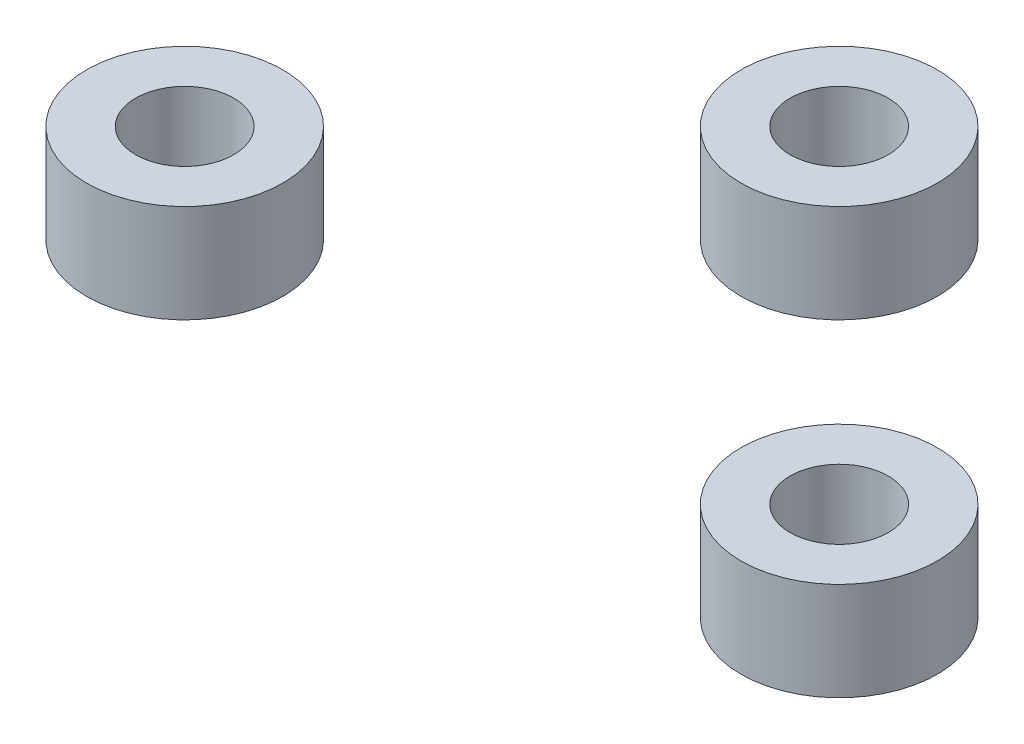
ISO-10303-21;
HEADER;
FILE_DESCRIPTION(('STEP AP214'),'2;1');
FILE_NAME('part.step','',(''),(''),'','','');
FILE_SCHEMA(('AUTOMOTIVE_DESIGN { 1 0 10303 214 1 1 1 1 }'));
ENDSEC;
DATA;
#1=APPLICATION_CONTEXT('core data for automotive mechanical design processes');
#2=APPLICATION_PROTOCOL_DEFINITION('international standard','automotive_design',2000,#1);
#3=PRODUCT_CONTEXT('',#1,'mechanical');
#4=PRODUCT('Part','Part','',(#3));
#5=PRODUCT_RELATED_PRODUCT_CATEGORY('part','',(#4));
#6=PRODUCT_DEFINITION_FORMATION('','',#4);
#7=PRODUCT_DEFINITION_CONTEXT('part definition',#1,'design');
#8=PRODUCT_DEFINITION('design','',#6,#7);
#9=PRODUCT_DEFINITION_SHAPE('','',#8);
#10=(LENGTH_UNIT() NAMED_UNIT(*) SI_UNIT(.MILLI.,.METRE.));
#11=(NAMED_UNIT(*) PLANE_ANGLE_UNIT() SI_UNIT($,.RADIAN.));
#12=(NAMED_UNIT(*) SI_UNIT($,.STERADIAN.) SOLID_ANGLE_UNIT());
#13=UNCERTAINTY_MEASURE_WITH_UNIT(LENGTH_MEASURE(1.E-05),#10,'distance_accuracy_value','');
#14=(GEOMETRIC_REPRESENTATION_CONTEXT(3) GLOBAL_UNCERTAINTY_ASSIGNED_CONTEXT((#13)) GLOBAL_UNIT_ASSIGNED_CONTEXT((#10,
#11,#12)) REPRESENTATION_CONTEXT('',''));
#15=CARTESIAN_POINT('',(0.,0.,0.));
#16=DIRECTION('',(0.,0.,1.));
#17=DIRECTION('',(1.,0.,0.));
#18=AXIS2_PLACEMENT_3D('',#15,#16,#17);
#19=CARTESIAN_POINT('',(0.,30.,0.));
#20=DIRECTION('',(0.,-1.,0.));
#21=DIRECTION('',(0.,0.,-1.));
#22=AXIS2_PLACEMENT_3D('',#19,#20,#21);
#23=CYLINDRICAL_SURFACE('',#22,15.);
#24=CARTESIAN_POINT('',(0.,30.,0.));
#25=DIRECTION('',(0.,1.,0.));
#26=DIRECTION('',(0.,0.,1.));
#27=AXIS2_PLACEMENT_3D('',#24,#25,#26);
#28=CIRCLE('',#27,15.);
#29=CARTESIAN_POINT('',(0.,30.,15.));
#30=VERTEX_POINT('',#29);
#31=EDGE_CURVE('E53',#30,#30,#28,.T.);
#32=ORIENTED_EDGE('',*,*,#31,.T.);
#33=EDGE_LOOP('',(#32));
#34=FACE_BOUND('',#33,.T.);
#35=CARTESIAN_POINT('',(0.,0.,0.));
#36=DIRECTION('',(0.,1.,0.));
#37=DIRECTION('',(0.,0.,1.));
#38=AXIS2_PLACEMENT_3D('',#35,#36,#37);
#39=CIRCLE('',#38,15.);
#40=CARTESIAN_POINT('',(0.,0.,15.));
#41=VERTEX_POINT('',#40);
#42=EDGE_CURVE('E59',#41,#41,#39,.T.);
#43=ORIENTED_EDGE('',*,*,#42,.F.);
#44=EDGE_LOOP('',(#43));
#45=FACE_BOUND('',#44,.T.);
#46=ADVANCED_FACE('F46',(#34,#45),#23,.F.);
#47=CARTESIAN_POINT('',(0.,30.,0.));
#48=DIRECTION('',(0.,-1.,0.));
#49=DIRECTION('',(0.,0.,-1.));
#50=AXIS2_PLACEMENT_3D('',#47,#48,#49);
#51=CYLINDRICAL_SURFACE('',#50,30.);
#52=CARTESIAN_POINT('',(0.,30.,0.));
#53=DIRECTION('',(0.,1.,0.));
#54=DIRECTION('',(0.,0.,1.));
#55=AXIS2_PLACEMENT_3D('',#52,#53,#54);
#56=CIRCLE('',#55,30.);
#57=CARTESIAN_POINT('',(0.,30.,30.));
#58=VERTEX_POINT('',#57);
#59=EDGE_CURVE('E11',#58,#58,#56,.T.);
#60=ORIENTED_EDGE('',*,*,#59,.F.);
#61=EDGE_LOOP('',(#60));
#62=FACE_BOUND('',#61,.T.);
#63=CARTESIAN_POINT('',(0.,0.,0.));
#64=DIRECTION('',(0.,1.,0.));
#65=DIRECTION('',(0.,0.,1.));
#66=AXIS2_PLACEMENT_3D('',#63,#64,#65);
#67=CIRCLE('',#66,30.);
#68=CARTESIAN_POINT('',(0.,0.,30.));
#69=VERTEX_POINT('',#68);
#70=EDGE_CURVE('E49',#69,#69,#67,.T.);
#71=ORIENTED_EDGE('',*,*,#70,.T.);
#72=EDGE_LOOP('',(#71));
#73=FACE_BOUND('',#72,.T.);
#74=ADVANCED_FACE('F66',(#62,#73),#51,.T.);
#75=CARTESIAN_POINT('',(0.,30.,0.));
#76=DIRECTION('',(0.,1.,0.));
#77=DIRECTION('',(0.,0.,1.));
#78=AXIS2_PLACEMENT_3D('',#75,#76,#77);
#79=PLANE('',#78);
#80=ORIENTED_EDGE('',*,*,#31,.F.);
#81=EDGE_LOOP('',(#80));
#82=FACE_BOUND('',#81,.T.);
#83=ORIENTED_EDGE('',*,*,#59,.T.);
#84=EDGE_LOOP('',(#83));
#85=FACE_BOUND('',#84,.T.);
#86=ADVANCED_FACE('F70',(#82,#85),#79,.T.);
#87=CARTESIAN_POINT('',(0.,0.,0.));
#88=DIRECTION('',(0.,1.,0.));
#89=DIRECTION('',(0.,0.,1.));
#90=AXIS2_PLACEMENT_3D('',#87,#88,#89);
#91=PLANE('',#90);
#92=ORIENTED_EDGE('',*,*,#42,.T.);
#93=EDGE_LOOP('',(#92));
#94=FACE_BOUND('',#93,.T.);
#95=ORIENTED_EDGE('',*,*,#70,.F.);
#96=EDGE_LOOP('',(#95));
#97=FACE_BOUND('',#96,.T.);
#98=ADVANCED_FACE('F68',(#94,#97),#91,.F.);
#99=CLOSED_SHELL('',(#46,#74,#86,#98));
#100=MANIFOLD_SOLID_BREP('B2',#99);
#101=CARTESIAN_POINT('',(100.,30.,-100.));
#102=DIRECTION('',(0.,-1.,0.));
#103=DIRECTION('',(0.,0.,-1.));
#104=AXIS2_PLACEMENT_3D('',#101,#102,#103);
#105=CYLINDRICAL_SURFACE('',#104,15.);
#106=CARTESIAN_POINT('',(100.,30.,-100.));
#107=DIRECTION('',(0.,1.,0.));
#108=DIRECTION('',(0.,0.,1.));
#109=AXIS2_PLACEMENT_3D('',#106,#107,#108);
#110=CIRCLE('',#109,15.);
#111=CARTESIAN_POINT('',(100.,30.,-85.));
#112=VERTEX_POINT('',#111);
#113=EDGE_CURVE('E133',#112,#112,#110,.T.);
#114=ORIENTED_EDGE('',*,*,#113,.T.);
#115=EDGE_LOOP('',(#114));
#116=FACE_BOUND('',#115,.T.);
#117=CARTESIAN_POINT('',(100.,0.,-100.));
#118=DIRECTION('',(0.,1.,0.));
#119=DIRECTION('',(0.,0.,1.));
#120=AXIS2_PLACEMENT_3D('',#117,#118,#119);
#121=CIRCLE('',#120,15.);
#122=CARTESIAN_POINT('',(100.,0.,-85.));
#123=VERTEX_POINT('',#122);
#124=EDGE_CURVE('E139',#123,#123,#121,.T.);
#125=ORIENTED_EDGE('',*,*,#124,.F.);
#126=EDGE_LOOP('',(#125));
#127=FACE_BOUND('',#126,.T.);
#128=ADVANCED_FACE('F126',(#116,#127),#105,.F.);
#129=CARTESIAN_POINT('',(100.,30.,-100.));
#130=DIRECTION('',(0.,-1.,0.));
#131=DIRECTION('',(0.,0.,-1.));
#132=AXIS2_PLACEMENT_3D('',#129,#130,#131);
#133=CYLINDRICAL_SURFACE('',#132,30.);
#134=CARTESIAN_POINT('',(100.,30.,-100.));
#135=DIRECTION('',(0.,1.,0.));
#136=DIRECTION('',(0.,0.,1.));
#137=AXIS2_PLACEMENT_3D('',#134,#135,#136);
#138=CIRCLE('',#137,30.);
#139=CARTESIAN_POINT('',(100.,30.,-70.));
#140=VERTEX_POINT('',#139);
#141=EDGE_CURVE('E45',#140,#140,#138,.T.);
#142=ORIENTED_EDGE('',*,*,#141,.F.);
#143=EDGE_LOOP('',(#142));
#144=FACE_BOUND('',#143,.T.);
#145=CARTESIAN_POINT('',(100.,0.,-100.));
#146=DIRECTION('',(0.,1.,0.));
#147=DIRECTION('',(0.,0.,1.));
#148=AXIS2_PLACEMENT_3D('',#145,#146,#147);
#149=CIRCLE('',#148,30.);
#150=CARTESIAN_POINT('',(100.,0.,-70.));
#151=VERTEX_POINT('',#150);
#152=EDGE_CURVE('E129',#151,#151,#149,.T.);
#153=ORIENTED_EDGE('',*,*,#152,.T.);
#154=EDGE_LOOP('',(#153));
#155=FACE_BOUND('',#154,.T.);
#156=ADVANCED_FACE('F146',(#144,#155),#133,.T.);
#157=CARTESIAN_POINT('',(0.,30.,0.));
#158=DIRECTION('',(0.,1.,0.));
#159=DIRECTION('',(0.,0.,1.));
#160=AXIS2_PLACEMENT_3D('',#157,#158,#159);
#161=PLANE('',#160);
#162=ORIENTED_EDGE('',*,*,#113,.F.);
#163=EDGE_LOOP('',(#162));
#164=FACE_BOUND('',#163,.T.);
#165=ORIENTED_EDGE('',*,*,#141,.T.);
#166=EDGE_LOOP('',(#165));
#167=FACE_BOUND('',#166,.T.);
#168=ADVANCED_FACE('F150',(#164,#167),#161,.T.);
#169=CARTESIAN_POINT('',(0.,0.,0.));
#170=DIRECTION('',(0.,1.,0.));
#171=DIRECTION('',(0.,0.,1.));
#172=AXIS2_PLACEMENT_3D('',#169,#170,#171);
#173=PLANE('',#172);
#174=ORIENTED_EDGE('',*,*,#124,.T.);
#175=EDGE_LOOP('',(#174));
#176=FACE_BOUND('',#175,.T.);
#177=ORIENTED_EDGE('',*,*,#152,.F.);
#178=EDGE_LOOP('',(#177));
#179=FACE_BOUND('',#178,.T.);
#180=ADVANCED_FACE('F148',(#176,#179),#173,.F.);
#181=CLOSED_SHELL('',(#128,#156,#168,#180));
#182=MANIFOLD_SOLID_BREP('B6',#181);
#183=CARTESIAN_POINT('',(200.,30.,0.));
#184=DIRECTION('',(0.,-1.,0.));
#185=DIRECTION('',(0.,0.,-1.));
#186=AXIS2_PLACEMENT_3D('',#183,#184,#185);
#187=CYLINDRICAL_SURFACE('',#186,15.);
#188=CARTESIAN_POINT('',(200.,30.,0.));
#189=DIRECTION('',(0.,1.,0.));
#190=DIRECTION('',(0.,0.,1.));
#191=AXIS2_PLACEMENT_3D('',#188,#189,#190);
#192=CIRCLE('',#191,15.);
#193=CARTESIAN_POINT('',(200.,30.,15.));
#194=VERTEX_POINT('',#193);
#195=EDGE_CURVE('E206',#194,#194,#192,.T.);
#196=ORIENTED_EDGE('',*,*,#195,.T.);
#197=EDGE_LOOP('',(#196));
#198=FACE_BOUND('',#197,.T.);
#199=CARTESIAN_POINT('',(200.,0.,0.));
#200=DIRECTION('',(0.,1.,0.));
#201=DIRECTION('',(0.,0.,1.));
#202=AXIS2_PLACEMENT_3D('',#199,#200,#201);
#203=CIRCLE('',#202,15.);
#204=CARTESIAN_POINT('',(200.,0.,15.));
#205=VERTEX_POINT('',#204);
#206=EDGE_CURVE('E212',#205,#205,#203,.T.);
#207=ORIENTED_EDGE('',*,*,#206,.F.);
#208=EDGE_LOOP('',(#207));
#209=FACE_BOUND('',#208,.T.);
#210=ADVANCED_FACE('F199',(#198,#209),#187,.F.);
#211=CARTESIAN_POINT('',(200.,30.,0.));
#212=DIRECTION('',(0.,-1.,0.));
#213=DIRECTION('',(0.,0.,-1.));
#214=AXIS2_PLACEMENT_3D('',#211,#212,#213);
#215=CYLINDRICAL_SURFACE('',#214,30.);
#216=CARTESIAN_POINT('',(200.,30.,0.));
#217=DIRECTION('',(0.,1.,0.));
#218=DIRECTION('',(0.,0.,1.));
#219=AXIS2_PLACEMENT_3D('',#216,#217,#218);
#220=CIRCLE('',#219,30.);
#221=CARTESIAN_POINT('',(200.,30.,30.));
#222=VERTEX_POINT('',#221);
#223=EDGE_CURVE('E125',#222,#222,#220,.T.);
#224=ORIENTED_EDGE('',*,*,#223,.F.);
#225=EDGE_LOOP('',(#224));
#226=FACE_BOUND('',#225,.T.);
#227=CARTESIAN_POINT('',(200.,0.,0.));
#228=DIRECTION('',(0.,1.,0.));
#229=DIRECTION('',(0.,0.,1.));
#230=AXIS2_PLACEMENT_3D('',#227,#228,#229);
#231=CIRCLE('',#230,30.);
#232=CARTESIAN_POINT('',(200.,0.,30.));
#233=VERTEX_POINT('',#232);
#234=EDGE_CURVE('E202',#233,#233,#231,.T.);
#235=ORIENTED_EDGE('',*,*,#234,.T.);
#236=EDGE_LOOP('',(#235));
#237=FACE_BOUND('',#236,.T.);
#238=ADVANCED_FACE('F219',(#226,#237),#215,.T.);
#239=CARTESIAN_POINT('',(0.,30.,0.));
#240=DIRECTION('',(0.,1.,0.));
#241=DIRECTION('',(0.,0.,1.));
#242=AXIS2_PLACEMENT_3D('',#239,#240,#241);
#243=PLANE('',#242);
#244=ORIENTED_EDGE('',*,*,#195,.F.);
#245=EDGE_LOOP('',(#244));
#246=FACE_BOUND('',#245,.T.);
#247=ORIENTED_EDGE('',*,*,#223,.T.);
#248=EDGE_LOOP('',(#247));
#249=FACE_BOUND('',#248,.T.);
#250=ADVANCED_FACE('F223',(#246,#249),#243,.T.);
#251=CARTESIAN_POINT('',(0.,0.,0.));
#252=DIRECTION('',(0.,1.,0.));
#253=DIRECTION('',(0.,0.,1.));
#254=AXIS2_PLACEMENT_3D('',#251,#252,#253);
#255=PLANE('',#254);
#256=ORIENTED_EDGE('',*,*,#206,.T.);
#257=EDGE_LOOP('',(#256));
#258=FACE_BOUND('',#257,.T.);
#259=ORIENTED_EDGE('',*,*,#234,.F.);
#260=EDGE_LOOP('',(#259));
#261=FACE_BOUND('',#260,.T.);
#262=ADVANCED_FACE('F221',(#258,#261),#255,.F.);
#263=CLOSED_SHELL('',(#210,#238,#250,#262));
#264=MANIFOLD_SOLID_BREP('B40',#263);
#265=ADVANCED_BREP_SHAPE_REPRESENTATION('',(#18,#100,#182,#264),#14);
#266=SHAPE_DEFINITION_REPRESENTATION(#9,#265);
ENDSEC;
END-ISO-10303-21;
